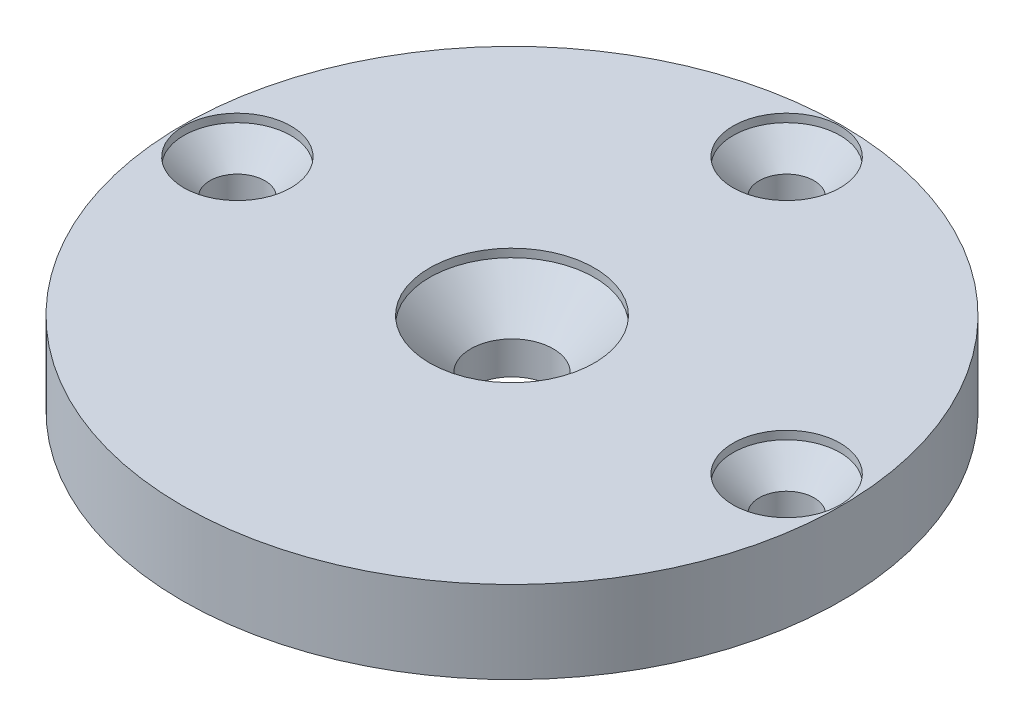
ISO-10303-21;
HEADER;
FILE_DESCRIPTION(('STEP AP214'),'2;1');
FILE_NAME('part.step','',(''),(''),'','','');
FILE_SCHEMA(('AUTOMOTIVE_DESIGN { 1 0 10303 214 1 1 1 1 }'));
ENDSEC;
DATA;
#1=APPLICATION_CONTEXT('core data for automotive mechanical design processes');
#2=APPLICATION_PROTOCOL_DEFINITION('international standard','automotive_design',2000,#1);
#3=PRODUCT_CONTEXT('',#1,'mechanical');
#4=PRODUCT('Part','Part','',(#3));
#5=PRODUCT_RELATED_PRODUCT_CATEGORY('part','',(#4));
#6=PRODUCT_DEFINITION_FORMATION('','',#4);
#7=PRODUCT_DEFINITION_CONTEXT('part definition',#1,'design');
#8=PRODUCT_DEFINITION('design','',#6,#7);
#9=PRODUCT_DEFINITION_SHAPE('','',#8);
#10=(LENGTH_UNIT() NAMED_UNIT(*) SI_UNIT(.MILLI.,.METRE.));
#11=(NAMED_UNIT(*) PLANE_ANGLE_UNIT() SI_UNIT($,.RADIAN.));
#12=(NAMED_UNIT(*) SI_UNIT($,.STERADIAN.) SOLID_ANGLE_UNIT());
#13=UNCERTAINTY_MEASURE_WITH_UNIT(LENGTH_MEASURE(1.E-05),#10,'distance_accuracy_value','');
#14=(GEOMETRIC_REPRESENTATION_CONTEXT(3) GLOBAL_UNCERTAINTY_ASSIGNED_CONTEXT((#13)) GLOBAL_UNIT_ASSIGNED_CONTEXT((#10,
#11,#12)) REPRESENTATION_CONTEXT('',''));
#15=CARTESIAN_POINT('',(0.,0.,0.));
#16=DIRECTION('',(0.,0.,1.));
#17=DIRECTION('',(1.,0.,0.));
#18=AXIS2_PLACEMENT_3D('',#15,#16,#17);
#19=CARTESIAN_POINT('',(0.,3.,0.));
#20=DIRECTION('',(0.,-1.,0.));
#21=DIRECTION('',(0.,0.,-1.));
#22=AXIS2_PLACEMENT_3D('',#19,#20,#21);
#23=CYLINDRICAL_SURFACE('',#22,1.5);
#24=CARTESIAN_POINT('',(0.,0.,0.));
#25=DIRECTION('',(0.,1.,0.));
#26=DIRECTION('',(0.,0.,1.));
#27=AXIS2_PLACEMENT_3D('',#24,#25,#26);
#28=CIRCLE('',#27,1.5);
#29=CARTESIAN_POINT('',(0.,0.,1.5));
#30=VERTEX_POINT('',#29);
#31=EDGE_CURVE('E41',#30,#30,#28,.T.);
#32=ORIENTED_EDGE('',*,*,#31,.F.);
#33=EDGE_LOOP('',(#32));
#34=FACE_BOUND('',#33,.T.);
#35=CARTESIAN_POINT('',(0.,1.2,0.));
#36=DIRECTION('',(0.,1.,0.));
#37=DIRECTION('',(0.,0.,1.));
#38=AXIS2_PLACEMENT_3D('',#35,#36,#37);
#39=CIRCLE('',#38,1.5);
#40=CARTESIAN_POINT('',(0.,1.2,1.5));
#41=VERTEX_POINT('',#40);
#42=EDGE_CURVE('E85',#41,#41,#39,.T.);
#43=ORIENTED_EDGE('',*,*,#42,.T.);
#44=EDGE_LOOP('',(#43));
#45=FACE_BOUND('',#44,.T.);
#46=ADVANCED_FACE('F37',(#34,#45),#23,.F.);
#47=CARTESIAN_POINT('',(-10.,3.,0.));
#48=DIRECTION('',(0.,-1.,0.));
#49=DIRECTION('',(0.,0.,-1.));
#50=AXIS2_PLACEMENT_3D('',#47,#48,#49);
#51=CYLINDRICAL_SURFACE('',#50,1.);
#52=CARTESIAN_POINT('',(-10.,0.,0.));
#53=DIRECTION('',(0.,1.,0.));
#54=DIRECTION('',(0.,0.,1.));
#55=AXIS2_PLACEMENT_3D('',#52,#53,#54);
#56=CIRCLE('',#55,1.);
#57=CARTESIAN_POINT('',(-10.,0.,1.));
#58=VERTEX_POINT('',#57);
#59=EDGE_CURVE('E60',#58,#58,#56,.T.);
#60=ORIENTED_EDGE('',*,*,#59,.F.);
#61=EDGE_LOOP('',(#60));
#62=FACE_BOUND('',#61,.T.);
#63=CARTESIAN_POINT('',(-10.,1.75,0.));
#64=DIRECTION('',(0.,1.,0.));
#65=DIRECTION('',(0.,0.,1.));
#66=AXIS2_PLACEMENT_3D('',#63,#64,#65);
#67=CIRCLE('',#66,1.);
#68=CARTESIAN_POINT('',(-10.,1.75,1.));
#69=VERTEX_POINT('',#68);
#70=EDGE_CURVE('E100',#69,#69,#67,.T.);
#71=ORIENTED_EDGE('',*,*,#70,.T.);
#72=EDGE_LOOP('',(#71));
#73=FACE_BOUND('',#72,.T.);
#74=ADVANCED_FACE('F81',(#62,#73),#51,.F.);
#75=CARTESIAN_POINT('',(0.,3.,-10.));
#76=DIRECTION('',(0.,-1.,0.));
#77=DIRECTION('',(0.,0.,-1.));
#78=AXIS2_PLACEMENT_3D('',#75,#76,#77);
#79=CYLINDRICAL_SURFACE('',#78,1.);
#80=CARTESIAN_POINT('',(0.,0.,-10.));
#81=DIRECTION('',(0.,1.,0.));
#82=DIRECTION('',(0.,0.,1.));
#83=AXIS2_PLACEMENT_3D('',#80,#81,#82);
#84=CIRCLE('',#83,1.);
#85=CARTESIAN_POINT('',(0.,0.,-9.));
#86=VERTEX_POINT('',#85);
#87=EDGE_CURVE('E63',#86,#86,#84,.T.);
#88=ORIENTED_EDGE('',*,*,#87,.F.);
#89=EDGE_LOOP('',(#88));
#90=FACE_BOUND('',#89,.T.);
#91=CARTESIAN_POINT('',(0.,1.75,-10.));
#92=DIRECTION('',(0.,1.,0.));
#93=DIRECTION('',(0.,0.,1.));
#94=AXIS2_PLACEMENT_3D('',#91,#92,#93);
#95=CIRCLE('',#94,1.);
#96=CARTESIAN_POINT('',(0.,1.75,-9.));
#97=VERTEX_POINT('',#96);
#98=EDGE_CURVE('E109',#97,#97,#95,.T.);
#99=ORIENTED_EDGE('',*,*,#98,.T.);
#100=EDGE_LOOP('',(#99));
#101=FACE_BOUND('',#100,.T.);
#102=ADVANCED_FACE('F139',(#90,#101),#79,.F.);
#103=CARTESIAN_POINT('',(10.,3.,0.));
#104=DIRECTION('',(0.,-1.,0.));
#105=DIRECTION('',(0.,0.,-1.));
#106=AXIS2_PLACEMENT_3D('',#103,#104,#105);
#107=CYLINDRICAL_SURFACE('',#106,1.);
#108=CARTESIAN_POINT('',(10.,0.,0.));
#109=DIRECTION('',(0.,1.,0.));
#110=DIRECTION('',(0.,0.,1.));
#111=AXIS2_PLACEMENT_3D('',#108,#109,#110);
#112=CIRCLE('',#111,1.);
#113=CARTESIAN_POINT('',(10.,0.,1.));
#114=VERTEX_POINT('',#113);
#115=EDGE_CURVE('E56',#114,#114,#112,.T.);
#116=ORIENTED_EDGE('',*,*,#115,.F.);
#117=EDGE_LOOP('',(#116));
#118=FACE_BOUND('',#117,.T.);
#119=CARTESIAN_POINT('',(10.,1.75,0.));
#120=DIRECTION('',(0.,1.,0.));
#121=DIRECTION('',(0.,0.,1.));
#122=AXIS2_PLACEMENT_3D('',#119,#120,#121);
#123=CIRCLE('',#122,1.);
#124=CARTESIAN_POINT('',(10.,1.75,1.));
#125=VERTEX_POINT('',#124);
#126=EDGE_CURVE('E54',#125,#125,#123,.T.);
#127=ORIENTED_EDGE('',*,*,#126,.T.);
#128=EDGE_LOOP('',(#127));
#129=FACE_BOUND('',#128,.T.);
#130=ADVANCED_FACE('F39',(#118,#129),#107,.F.);
#131=CARTESIAN_POINT('',(0.,3.,0.));
#132=DIRECTION('',(0.,-1.,0.));
#133=DIRECTION('',(0.,0.,-1.));
#134=AXIS2_PLACEMENT_3D('',#131,#132,#133);
#135=CYLINDRICAL_SURFACE('',#134,12.);
#136=CARTESIAN_POINT('',(0.,3.,0.));
#137=DIRECTION('',(0.,1.,0.));
#138=DIRECTION('',(0.,0.,1.));
#139=AXIS2_PLACEMENT_3D('',#136,#137,#138);
#140=CIRCLE('',#139,12.);
#141=CARTESIAN_POINT('',(0.,3.,12.));
#142=VERTEX_POINT('',#141);
#143=EDGE_CURVE('E10',#142,#142,#140,.T.);
#144=ORIENTED_EDGE('',*,*,#143,.F.);
#145=EDGE_LOOP('',(#144));
#146=FACE_BOUND('',#145,.T.);
#147=CARTESIAN_POINT('',(0.,0.,0.));
#148=DIRECTION('',(0.,1.,0.));
#149=DIRECTION('',(0.,0.,1.));
#150=AXIS2_PLACEMENT_3D('',#147,#148,#149);
#151=CIRCLE('',#150,12.);
#152=CARTESIAN_POINT('',(0.,0.,12.));
#153=VERTEX_POINT('',#152);
#154=EDGE_CURVE('E51',#153,#153,#151,.T.);
#155=ORIENTED_EDGE('',*,*,#154,.T.);
#156=EDGE_LOOP('',(#155));
#157=FACE_BOUND('',#156,.T.);
#158=ADVANCED_FACE('F68',(#146,#157),#135,.T.);
#159=CARTESIAN_POINT('',(0.,3.,0.));
#160=DIRECTION('',(0.,1.,0.));
#161=DIRECTION('',(0.,0.,1.));
#162=AXIS2_PLACEMENT_3D('',#159,#160,#161);
#163=PLANE('',#162);
#164=CARTESIAN_POINT('',(0.,3.,0.));
#165=DIRECTION('',(0.,1.,0.));
#166=DIRECTION('',(0.,0.,1.));
#167=AXIS2_PLACEMENT_3D('',#164,#165,#166);
#168=CIRCLE('',#167,3.);
#169=CARTESIAN_POINT('',(0.,3.,3.));
#170=VERTEX_POINT('',#169);
#171=EDGE_CURVE('E94',#170,#170,#168,.T.);
#172=ORIENTED_EDGE('',*,*,#171,.F.);
#173=EDGE_LOOP('',(#172));
#174=FACE_BOUND('',#173,.T.);
#175=CARTESIAN_POINT('',(-10.,3.,0.));
#176=DIRECTION('',(0.,1.,0.));
#177=DIRECTION('',(0.,0.,1.));
#178=AXIS2_PLACEMENT_3D('',#175,#176,#177);
#179=CIRCLE('',#178,1.95);
#180=CARTESIAN_POINT('',(-10.,3.,1.95));
#181=VERTEX_POINT('',#180);
#182=EDGE_CURVE('E87',#181,#181,#179,.T.);
#183=ORIENTED_EDGE('',*,*,#182,.F.);
#184=EDGE_LOOP('',(#183));
#185=FACE_BOUND('',#184,.T.);
#186=CARTESIAN_POINT('',(0.,3.,-10.));
#187=DIRECTION('',(0.,1.,0.));
#188=DIRECTION('',(0.,0.,1.));
#189=AXIS2_PLACEMENT_3D('',#186,#187,#188);
#190=CIRCLE('',#189,1.95);
#191=CARTESIAN_POINT('',(0.,3.,-8.05));
#192=VERTEX_POINT('',#191);
#193=EDGE_CURVE('E103',#192,#192,#190,.T.);
#194=ORIENTED_EDGE('',*,*,#193,.F.);
#195=EDGE_LOOP('',(#194));
#196=FACE_BOUND('',#195,.T.);
#197=CARTESIAN_POINT('',(10.,3.,0.));
#198=DIRECTION('',(0.,1.,0.));
#199=DIRECTION('',(0.,0.,1.));
#200=AXIS2_PLACEMENT_3D('',#197,#198,#199);
#201=CIRCLE('',#200,1.95);
#202=CARTESIAN_POINT('',(10.,3.,1.95));
#203=VERTEX_POINT('',#202);
#204=EDGE_CURVE('E112',#203,#203,#201,.T.);
#205=ORIENTED_EDGE('',*,*,#204,.F.);
#206=EDGE_LOOP('',(#205));
#207=FACE_BOUND('',#206,.T.);
#208=ORIENTED_EDGE('',*,*,#143,.T.);
#209=EDGE_LOOP('',(#208));
#210=FACE_BOUND('',#209,.T.);
#211=ADVANCED_FACE('F74',(#174,#185,#196,#207,#210),#163,.T.);
#212=CARTESIAN_POINT('',(0.,0.,0.));
#213=DIRECTION('',(0.,1.,0.));
#214=DIRECTION('',(0.,0.,1.));
#215=AXIS2_PLACEMENT_3D('',#212,#213,#214);
#216=PLANE('',#215);
#217=ORIENTED_EDGE('',*,*,#115,.T.);
#218=EDGE_LOOP('',(#217));
#219=FACE_BOUND('',#218,.T.);
#220=ORIENTED_EDGE('',*,*,#59,.T.);
#221=EDGE_LOOP('',(#220));
#222=FACE_BOUND('',#221,.T.);
#223=ORIENTED_EDGE('',*,*,#87,.T.);
#224=EDGE_LOOP('',(#223));
#225=FACE_BOUND('',#224,.T.);
#226=ORIENTED_EDGE('',*,*,#154,.F.);
#227=EDGE_LOOP('',(#226));
#228=FACE_BOUND('',#227,.T.);
#229=ORIENTED_EDGE('',*,*,#31,.T.);
#230=EDGE_LOOP('',(#229));
#231=FACE_BOUND('',#230,.T.);
#232=ADVANCED_FACE('F70',(#219,#222,#225,#228,#231),#216,.F.);
#233=CARTESIAN_POINT('',(10.,2.7,0.));
#234=DIRECTION('',(0.,1.,0.));
#235=DIRECTION('',(0.,0.,1.));
#236=AXIS2_PLACEMENT_3D('',#233,#234,#235);
#237=CONICAL_SURFACE('',#236,1.95,0.785398163397448);
#238=ORIENTED_EDGE('',*,*,#126,.F.);
#239=EDGE_LOOP('',(#238));
#240=FACE_BOUND('',#239,.T.);
#241=CARTESIAN_POINT('',(10.,2.7,0.));
#242=DIRECTION('',(0.,1.,0.));
#243=DIRECTION('',(0.,0.,1.));
#244=AXIS2_PLACEMENT_3D('',#241,#242,#243);
#245=CIRCLE('',#244,1.95);
#246=CARTESIAN_POINT('',(10.,2.7,1.95));
#247=VERTEX_POINT('',#246);
#248=EDGE_CURVE('E114',#247,#247,#245,.T.);
#249=ORIENTED_EDGE('',*,*,#248,.T.);
#250=EDGE_LOOP('',(#249));
#251=FACE_BOUND('',#250,.T.);
#252=ADVANCED_FACE('F73',(#240,#251),#237,.F.);
#253=CARTESIAN_POINT('',(10.,3.,0.));
#254=DIRECTION('',(0.,1.,0.));
#255=DIRECTION('',(0.,0.,1.));
#256=AXIS2_PLACEMENT_3D('',#253,#254,#255);
#257=CYLINDRICAL_SURFACE('',#256,1.95);
#258=ORIENTED_EDGE('',*,*,#248,.F.);
#259=EDGE_LOOP('',(#258));
#260=FACE_BOUND('',#259,.T.);
#261=ORIENTED_EDGE('',*,*,#204,.T.);
#262=EDGE_LOOP('',(#261));
#263=FACE_BOUND('',#262,.T.);
#264=ADVANCED_FACE('F123',(#260,#263),#257,.F.);
#265=CARTESIAN_POINT('',(0.,2.7,-10.));
#266=DIRECTION('',(0.,1.,0.));
#267=DIRECTION('',(0.,0.,1.));
#268=AXIS2_PLACEMENT_3D('',#265,#266,#267);
#269=CONICAL_SURFACE('',#268,1.95,0.785398163397448);
#270=ORIENTED_EDGE('',*,*,#98,.F.);
#271=EDGE_LOOP('',(#270));
#272=FACE_BOUND('',#271,.T.);
#273=CARTESIAN_POINT('',(0.,2.7,-10.));
#274=DIRECTION('',(0.,1.,0.));
#275=DIRECTION('',(0.,0.,1.));
#276=AXIS2_PLACEMENT_3D('',#273,#274,#275);
#277=CIRCLE('',#276,1.95);
#278=CARTESIAN_POINT('',(0.,2.7,-8.05));
#279=VERTEX_POINT('',#278);
#280=EDGE_CURVE('E106',#279,#279,#277,.T.);
#281=ORIENTED_EDGE('',*,*,#280,.T.);
#282=EDGE_LOOP('',(#281));
#283=FACE_BOUND('',#282,.T.);
#284=ADVANCED_FACE('F128',(#272,#283),#269,.F.);
#285=CARTESIAN_POINT('',(0.,3.,-10.));
#286=DIRECTION('',(0.,1.,0.));
#287=DIRECTION('',(0.,0.,1.));
#288=AXIS2_PLACEMENT_3D('',#285,#286,#287);
#289=CYLINDRICAL_SURFACE('',#288,1.95);
#290=ORIENTED_EDGE('',*,*,#280,.F.);
#291=EDGE_LOOP('',(#290));
#292=FACE_BOUND('',#291,.T.);
#293=ORIENTED_EDGE('',*,*,#193,.T.);
#294=EDGE_LOOP('',(#293));
#295=FACE_BOUND('',#294,.T.);
#296=ADVANCED_FACE('F154',(#292,#295),#289,.F.);
#297=CARTESIAN_POINT('',(-10.,2.7,0.));
#298=DIRECTION('',(0.,1.,0.));
#299=DIRECTION('',(0.,0.,1.));
#300=AXIS2_PLACEMENT_3D('',#297,#298,#299);
#301=CONICAL_SURFACE('',#300,1.95,0.785398163397448);
#302=ORIENTED_EDGE('',*,*,#70,.F.);
#303=EDGE_LOOP('',(#302));
#304=FACE_BOUND('',#303,.T.);
#305=CARTESIAN_POINT('',(-10.,2.7,0.));
#306=DIRECTION('',(0.,1.,0.));
#307=DIRECTION('',(0.,0.,1.));
#308=AXIS2_PLACEMENT_3D('',#305,#306,#307);
#309=CIRCLE('',#308,1.95);
#310=CARTESIAN_POINT('',(-10.,2.7,1.95));
#311=VERTEX_POINT('',#310);
#312=EDGE_CURVE('E91',#311,#311,#309,.T.);
#313=ORIENTED_EDGE('',*,*,#312,.T.);
#314=EDGE_LOOP('',(#313));
#315=FACE_BOUND('',#314,.T.);
#316=ADVANCED_FACE('F150',(#304,#315),#301,.F.);
#317=CARTESIAN_POINT('',(-10.,3.,0.));
#318=DIRECTION('',(0.,1.,0.));
#319=DIRECTION('',(0.,0.,1.));
#320=AXIS2_PLACEMENT_3D('',#317,#318,#319);
#321=CYLINDRICAL_SURFACE('',#320,1.95);
#322=ORIENTED_EDGE('',*,*,#312,.F.);
#323=EDGE_LOOP('',(#322));
#324=FACE_BOUND('',#323,.T.);
#325=ORIENTED_EDGE('',*,*,#182,.T.);
#326=EDGE_LOOP('',(#325));
#327=FACE_BOUND('',#326,.T.);
#328=ADVANCED_FACE('F153',(#324,#327),#321,.F.);
#329=CARTESIAN_POINT('',(0.,2.7,0.));
#330=DIRECTION('',(0.,1.,0.));
#331=DIRECTION('',(0.,0.,1.));
#332=AXIS2_PLACEMENT_3D('',#329,#330,#331);
#333=CONICAL_SURFACE('',#332,3.,0.785398163397449);
#334=ORIENTED_EDGE('',*,*,#42,.F.);
#335=EDGE_LOOP('',(#334));
#336=FACE_BOUND('',#335,.T.);
#337=CARTESIAN_POINT('',(0.,2.7,0.));
#338=DIRECTION('',(0.,1.,0.));
#339=DIRECTION('',(0.,0.,1.));
#340=AXIS2_PLACEMENT_3D('',#337,#338,#339);
#341=CIRCLE('',#340,3.);
#342=CARTESIAN_POINT('',(0.,2.7,3.));
#343=VERTEX_POINT('',#342);
#344=EDGE_CURVE('E88',#343,#343,#341,.T.);
#345=ORIENTED_EDGE('',*,*,#344,.T.);
#346=EDGE_LOOP('',(#345));
#347=FACE_BOUND('',#346,.T.);
#348=ADVANCED_FACE('F160',(#336,#347),#333,.F.);
#349=CARTESIAN_POINT('',(0.,3.,0.));
#350=DIRECTION('',(0.,1.,0.));
#351=DIRECTION('',(0.,0.,1.));
#352=AXIS2_PLACEMENT_3D('',#349,#350,#351);
#353=CYLINDRICAL_SURFACE('',#352,3.);
#354=ORIENTED_EDGE('',*,*,#344,.F.);
#355=EDGE_LOOP('',(#354));
#356=FACE_BOUND('',#355,.T.);
#357=ORIENTED_EDGE('',*,*,#171,.T.);
#358=EDGE_LOOP('',(#357));
#359=FACE_BOUND('',#358,.T.);
#360=ADVANCED_FACE('F181',(#356,#359),#353,.F.);
#361=CLOSED_SHELL('',(#46,#74,#102,#130,#158,#211,#232,#252,#264,#284,#296,#316,#328,#348,#360));
#362=MANIFOLD_SOLID_BREP('B2',#361);
#363=ADVANCED_BREP_SHAPE_REPRESENTATION('',(#18,#362),#14);
#364=SHAPE_DEFINITION_REPRESENTATION(#9,#363);
ENDSEC;
END-ISO-10303-21;
